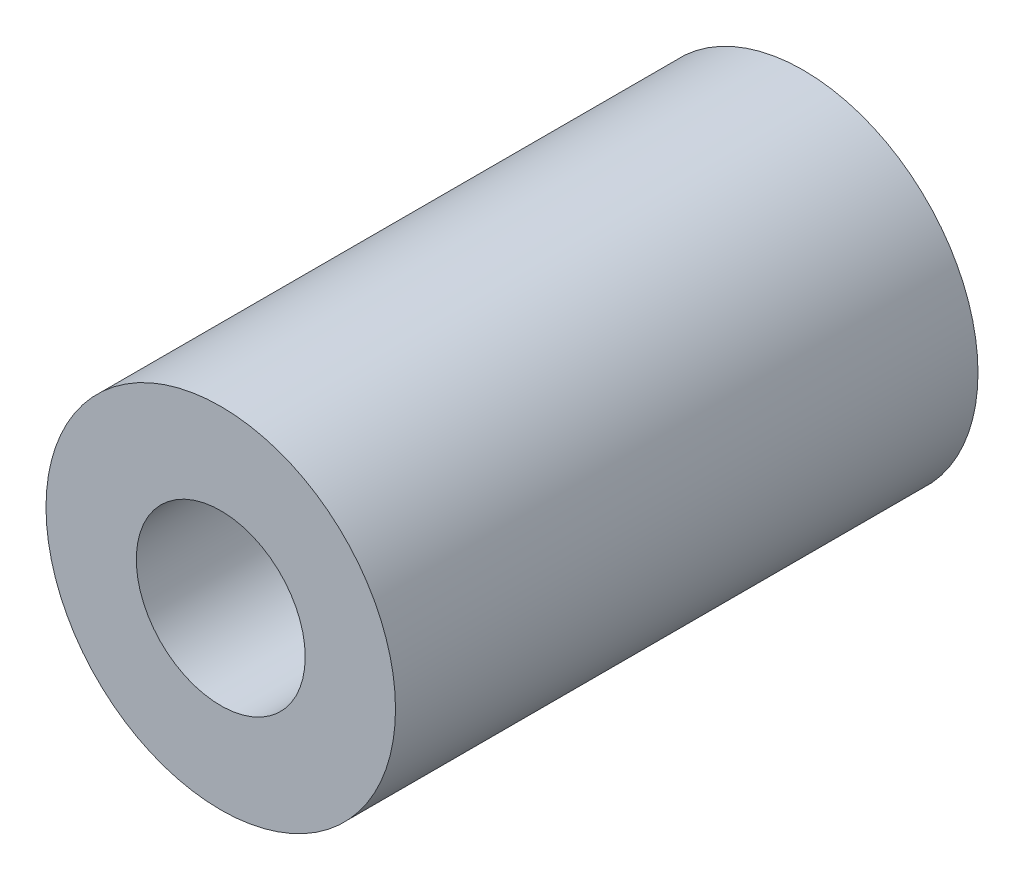
ISO-10303-21;
HEADER;
FILE_DESCRIPTION(('STEP AP214'),'2;1');
FILE_NAME('part.step','',(''),(''),'','','');
FILE_SCHEMA(('AUTOMOTIVE_DESIGN { 1 0 10303 214 1 1 1 1 }'));
ENDSEC;
DATA;
#1=APPLICATION_CONTEXT('core data for automotive mechanical design processes');
#2=APPLICATION_PROTOCOL_DEFINITION('international standard','automotive_design',2000,#1);
#3=PRODUCT_CONTEXT('',#1,'mechanical');
#4=PRODUCT('Part','Part','',(#3));
#5=PRODUCT_RELATED_PRODUCT_CATEGORY('part','',(#4));
#6=PRODUCT_DEFINITION_FORMATION('','',#4);
#7=PRODUCT_DEFINITION_CONTEXT('part definition',#1,'design');
#8=PRODUCT_DEFINITION('design','',#6,#7);
#9=PRODUCT_DEFINITION_SHAPE('','',#8);
#10=(LENGTH_UNIT() NAMED_UNIT(*) SI_UNIT(.MILLI.,.METRE.));
#11=(NAMED_UNIT(*) PLANE_ANGLE_UNIT() SI_UNIT($,.RADIAN.));
#12=(NAMED_UNIT(*) SI_UNIT($,.STERADIAN.) SOLID_ANGLE_UNIT());
#13=UNCERTAINTY_MEASURE_WITH_UNIT(LENGTH_MEASURE(1.E-05),#10,'distance_accuracy_value','');
#14=(GEOMETRIC_REPRESENTATION_CONTEXT(3) GLOBAL_UNCERTAINTY_ASSIGNED_CONTEXT((#13)) GLOBAL_UNIT_ASSIGNED_CONTEXT((#10,
#11,#12)) REPRESENTATION_CONTEXT('',''));
#15=CARTESIAN_POINT('',(0.,0.,0.));
#16=DIRECTION('',(0.,0.,1.));
#17=DIRECTION('',(1.,0.,0.));
#18=AXIS2_PLACEMENT_3D('',#15,#16,#17);
#19=CARTESIAN_POINT('',(0.,0.,50.));
#20=DIRECTION('',(0.,0.,1.));
#21=DIRECTION('',(1.,0.,0.));
#22=AXIS2_PLACEMENT_3D('',#19,#20,#21);
#23=PLANE('',#22);
#24=CARTESIAN_POINT('',(0.,0.,50.));
#25=DIRECTION('',(0.,0.,1.));
#26=DIRECTION('',(1.,0.,0.));
#27=AXIS2_PLACEMENT_3D('',#24,#25,#26);
#28=CIRCLE('',#27,15.);
#29=CARTESIAN_POINT('',(15.,0.,50.));
#30=VERTEX_POINT('',#29);
#31=EDGE_CURVE('E10',#30,#30,#28,.T.);
#32=ORIENTED_EDGE('',*,*,#31,.T.);
#33=EDGE_LOOP('',(#32));
#34=FACE_BOUND('',#33,.T.);
#35=CARTESIAN_POINT('',(0.,0.,50.));
#36=DIRECTION('',(0.,0.,1.));
#37=DIRECTION('',(1.,0.,0.));
#38=AXIS2_PLACEMENT_3D('',#35,#36,#37);
#39=CIRCLE('',#38,7.25);
#40=CARTESIAN_POINT('',(7.25,0.,50.));
#41=VERTEX_POINT('',#40);
#42=EDGE_CURVE('E47',#41,#41,#39,.T.);
#43=ORIENTED_EDGE('',*,*,#42,.F.);
#44=EDGE_LOOP('',(#43));
#45=FACE_BOUND('',#44,.T.);
#46=ADVANCED_FACE('F36',(#34,#45),#23,.T.);
#47=CARTESIAN_POINT('',(0.,0.,0.));
#48=DIRECTION('',(0.,0.,1.));
#49=DIRECTION('',(1.,0.,0.));
#50=AXIS2_PLACEMENT_3D('',#47,#48,#49);
#51=PLANE('',#50);
#52=CARTESIAN_POINT('',(0.,0.,0.));
#53=DIRECTION('',(0.,0.,1.));
#54=DIRECTION('',(1.,0.,0.));
#55=AXIS2_PLACEMENT_3D('',#52,#53,#54);
#56=CIRCLE('',#55,15.);
#57=CARTESIAN_POINT('',(15.,0.,0.));
#58=VERTEX_POINT('',#57);
#59=EDGE_CURVE('E40',#58,#58,#56,.T.);
#60=ORIENTED_EDGE('',*,*,#59,.F.);
#61=EDGE_LOOP('',(#60));
#62=FACE_BOUND('',#61,.T.);
#63=CARTESIAN_POINT('',(0.,0.,0.));
#64=DIRECTION('',(0.,0.,1.));
#65=DIRECTION('',(1.,0.,0.));
#66=AXIS2_PLACEMENT_3D('',#63,#64,#65);
#67=CIRCLE('',#66,7.25);
#68=CARTESIAN_POINT('',(7.25,0.,0.));
#69=VERTEX_POINT('',#68);
#70=EDGE_CURVE('E49',#69,#69,#67,.T.);
#71=ORIENTED_EDGE('',*,*,#70,.T.);
#72=EDGE_LOOP('',(#71));
#73=FACE_BOUND('',#72,.T.);
#74=ADVANCED_FACE('F59',(#62,#73),#51,.F.);
#75=CARTESIAN_POINT('',(0.,0.,50.));
#76=DIRECTION('',(0.,0.,-1.));
#77=DIRECTION('',(-1.,0.,0.));
#78=AXIS2_PLACEMENT_3D('',#75,#76,#77);
#79=CYLINDRICAL_SURFACE('',#78,15.);
#80=ORIENTED_EDGE('',*,*,#31,.F.);
#81=EDGE_LOOP('',(#80));
#82=FACE_BOUND('',#81,.T.);
#83=ORIENTED_EDGE('',*,*,#59,.T.);
#84=EDGE_LOOP('',(#83));
#85=FACE_BOUND('',#84,.T.);
#86=ADVANCED_FACE('F38',(#82,#85),#79,.T.);
#87=CARTESIAN_POINT('',(0.,0.,50.));
#88=DIRECTION('',(0.,0.,-1.));
#89=DIRECTION('',(-1.,0.,0.));
#90=AXIS2_PLACEMENT_3D('',#87,#88,#89);
#91=CYLINDRICAL_SURFACE('',#90,7.25);
#92=ORIENTED_EDGE('',*,*,#42,.T.);
#93=EDGE_LOOP('',(#92));
#94=FACE_BOUND('',#93,.T.);
#95=ORIENTED_EDGE('',*,*,#70,.F.);
#96=EDGE_LOOP('',(#95));
#97=FACE_BOUND('',#96,.T.);
#98=ADVANCED_FACE('F55',(#94,#97),#91,.F.);
#99=CLOSED_SHELL('',(#46,#74,#86,#98));
#100=MANIFOLD_SOLID_BREP('B2',#99);
#101=ADVANCED_BREP_SHAPE_REPRESENTATION('',(#18,#100),#14);
#102=SHAPE_DEFINITION_REPRESENTATION(#9,#101);
ENDSEC;
END-ISO-10303-21;
